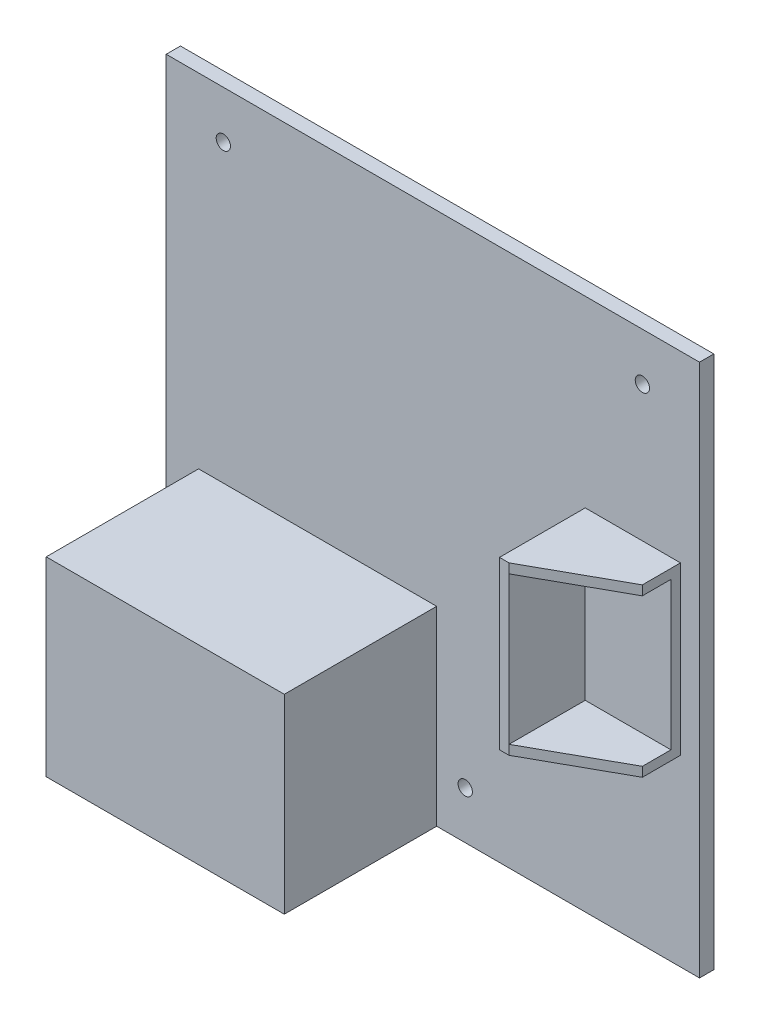
ISO-10303-21;
HEADER;
FILE_DESCRIPTION(('STEP AP214'),'2;1');
FILE_NAME('part.step','',(''),(''),'','','');
FILE_SCHEMA(('AUTOMOTIVE_DESIGN { 1 0 10303 214 1 1 1 1 }'));
ENDSEC;
DATA;
#1=APPLICATION_CONTEXT('core data for automotive mechanical design processes');
#2=APPLICATION_PROTOCOL_DEFINITION('international standard','automotive_design',2000,#1);
#3=PRODUCT_CONTEXT('',#1,'mechanical');
#4=PRODUCT('Part','Part','',(#3));
#5=PRODUCT_RELATED_PRODUCT_CATEGORY('part','',(#4));
#6=PRODUCT_DEFINITION_FORMATION('','',#4);
#7=PRODUCT_DEFINITION_CONTEXT('part definition',#1,'design');
#8=PRODUCT_DEFINITION('design','',#6,#7);
#9=PRODUCT_DEFINITION_SHAPE('','',#8);
#10=(LENGTH_UNIT() NAMED_UNIT(*) SI_UNIT(.MILLI.,.METRE.));
#11=(NAMED_UNIT(*) PLANE_ANGLE_UNIT() SI_UNIT($,.RADIAN.));
#12=(NAMED_UNIT(*) SI_UNIT($,.STERADIAN.) SOLID_ANGLE_UNIT());
#13=UNCERTAINTY_MEASURE_WITH_UNIT(LENGTH_MEASURE(1.E-05),#10,'distance_accuracy_value','');
#14=(GEOMETRIC_REPRESENTATION_CONTEXT(3) GLOBAL_UNCERTAINTY_ASSIGNED_CONTEXT((#13)) GLOBAL_UNIT_ASSIGNED_CONTEXT((#10,
#11,#12)) REPRESENTATION_CONTEXT('',''));
#15=CARTESIAN_POINT('',(0.,0.,0.));
#16=DIRECTION('',(0.,0.,1.));
#17=DIRECTION('',(1.,0.,0.));
#18=AXIS2_PLACEMENT_3D('',#15,#16,#17);
#19=CARTESIAN_POINT('',(0.,0.,3.));
#20=DIRECTION('',(0.,0.,-1.));
#21=DIRECTION('',(-1.,0.,0.));
#22=AXIS2_PLACEMENT_3D('',#19,#20,#21);
#23=PLANE('',#22);
#24=DIRECTION('',(0.,-1.,0.));
#25=VECTOR('',#24,1.);
#26=CARTESIAN_POINT('',(-49.1967650273224,-56.,3.));
#27=LINE('',#26,#25);
#28=CARTESIAN_POINT('',(-49.1967650273224,-16.,3.));
#29=VERTEX_POINT('',#28);
#30=CARTESIAN_POINT('',(-49.1967650273224,-56.,3.));
#31=VERTEX_POINT('',#30);
#32=EDGE_CURVE('E185',#29,#31,#27,.T.);
#33=ORIENTED_EDGE('',*,*,#32,.F.);
#34=DIRECTION('',(-1.,0.,0.));
#35=VECTOR('',#34,1.);
#36=CARTESIAN_POINT('',(-49.1967650273224,-16.,3.));
#37=LINE('',#36,#35);
#38=CARTESIAN_POINT('',(0.803234972677577,-16.,3.));
#39=VERTEX_POINT('',#38);
#40=EDGE_CURVE('E201',#39,#29,#37,.T.);
#41=ORIENTED_EDGE('',*,*,#40,.F.);
#42=DIRECTION('',(0.,1.,0.));
#43=VECTOR('',#42,1.);
#44=CARTESIAN_POINT('',(0.803234972677577,-56.,3.));
#45=LINE('',#44,#43);
#46=CARTESIAN_POINT('',(0.803234972677577,-56.,3.));
#47=VERTEX_POINT('',#46);
#48=EDGE_CURVE('E210',#47,#39,#45,.T.);
#49=ORIENTED_EDGE('',*,*,#48,.F.);
#50=DIRECTION('',(1.,0.,0.));
#51=VECTOR('',#50,1.);
#52=CARTESIAN_POINT('',(-56.,-56.,3.));
#53=LINE('',#52,#51);
#54=CARTESIAN_POINT('',(56.,-56.,3.));
#55=VERTEX_POINT('',#54);
#56=EDGE_CURVE('E235',#47,#55,#53,.T.);
#57=ORIENTED_EDGE('',*,*,#56,.T.);
#58=DIRECTION('',(0.,1.,0.));
#59=VECTOR('',#58,1.);
#60=CARTESIAN_POINT('',(56.,-56.,3.));
#61=LINE('',#60,#59);
#62=CARTESIAN_POINT('',(56.,56.,3.));
#63=VERTEX_POINT('',#62);
#64=EDGE_CURVE('E227',#55,#63,#61,.T.);
#65=ORIENTED_EDGE('',*,*,#64,.T.);
#66=DIRECTION('',(-1.,0.,0.));
#67=VECTOR('',#66,1.);
#68=CARTESIAN_POINT('',(-56.,56.,3.));
#69=LINE('',#68,#67);
#70=CARTESIAN_POINT('',(-56.,56.,3.));
#71=VERTEX_POINT('',#70);
#72=EDGE_CURVE('E230',#63,#71,#69,.T.);
#73=ORIENTED_EDGE('',*,*,#72,.T.);
#74=DIRECTION('',(0.,-1.,0.));
#75=VECTOR('',#74,1.);
#76=CARTESIAN_POINT('',(-56.,-56.,3.));
#77=LINE('',#76,#75);
#78=CARTESIAN_POINT('',(-56.,-56.,3.));
#79=VERTEX_POINT('',#78);
#80=EDGE_CURVE('E233',#71,#79,#77,.T.);
#81=ORIENTED_EDGE('',*,*,#80,.T.);
#82=EDGE_CURVE('E236',#79,#31,#53,.T.);
#83=ORIENTED_EDGE('',*,*,#82,.T.);
#84=EDGE_LOOP('',(#33,#41,#49,#57,#65,#73,#81,#83));
#85=FACE_BOUND('',#84,.T.);
#86=CARTESIAN_POINT('',(6.80323497267758,-46.,3.));
#87=DIRECTION('',(0.,0.,1.));
#88=DIRECTION('',(1.,0.,0.));
#89=AXIS2_PLACEMENT_3D('',#86,#87,#88);
#90=CIRCLE('',#89,1.5);
#91=CARTESIAN_POINT('',(8.30323497267758,-46.,3.));
#92=VERTEX_POINT('',#91);
#93=EDGE_CURVE('E175',#92,#92,#90,.T.);
#94=ORIENTED_EDGE('',*,*,#93,.F.);
#95=EDGE_LOOP('',(#94));
#96=FACE_BOUND('',#95,.T.);
#97=CARTESIAN_POINT('',(44.,46.,3.));
#98=DIRECTION('',(0.,0.,1.));
#99=DIRECTION('',(1.,0.,0.));
#100=AXIS2_PLACEMENT_3D('',#97,#98,#99);
#101=CIRCLE('',#100,1.5);
#102=CARTESIAN_POINT('',(45.5,46.,3.));
#103=VERTEX_POINT('',#102);
#104=EDGE_CURVE('E189',#103,#103,#101,.T.);
#105=ORIENTED_EDGE('',*,*,#104,.F.);
#106=EDGE_LOOP('',(#105));
#107=FACE_BOUND('',#106,.T.);
#108=CARTESIAN_POINT('',(-44.,46.,3.));
#109=DIRECTION('',(0.,0.,1.));
#110=DIRECTION('',(1.,0.,0.));
#111=AXIS2_PLACEMENT_3D('',#108,#109,#110);
#112=CIRCLE('',#111,1.5);
#113=CARTESIAN_POINT('',(-42.5,46.,3.));
#114=VERTEX_POINT('',#113);
#115=EDGE_CURVE('E182',#114,#114,#112,.T.);
#116=ORIENTED_EDGE('',*,*,#115,.F.);
#117=EDGE_LOOP('',(#116));
#118=FACE_BOUND('',#117,.T.);
#119=DIRECTION('',(0.,1.,0.));
#120=VECTOR('',#119,1.);
#121=CARTESIAN_POINT('',(52.,-17.5,3.));
#122=LINE('',#121,#120);
#123=CARTESIAN_POINT('',(52.,-17.5,3.));
#124=VERTEX_POINT('',#123);
#125=CARTESIAN_POINT('',(52.,17.5,3.));
#126=VERTEX_POINT('',#125);
#127=EDGE_CURVE('E170',#124,#126,#122,.T.);
#128=ORIENTED_EDGE('',*,*,#127,.F.);
#129=DIRECTION('',(1.,0.,0.));
#130=VECTOR('',#129,1.);
#131=CARTESIAN_POINT('',(32.,-17.5,3.));
#132=LINE('',#131,#130);
#133=CARTESIAN_POINT('',(32.,-17.5,3.));
#134=VERTEX_POINT('',#133);
#135=EDGE_CURVE('E523',#134,#124,#132,.T.);
#136=ORIENTED_EDGE('',*,*,#135,.F.);
#137=DIRECTION('',(0.,-1.,0.));
#138=VECTOR('',#137,1.);
#139=CARTESIAN_POINT('',(32.,-17.5,3.));
#140=LINE('',#139,#138);
#141=CARTESIAN_POINT('',(32.,17.5,3.));
#142=VERTEX_POINT('',#141);
#143=EDGE_CURVE('E532',#142,#134,#140,.T.);
#144=ORIENTED_EDGE('',*,*,#143,.F.);
#145=DIRECTION('',(-1.,0.,0.));
#146=VECTOR('',#145,1.);
#147=CARTESIAN_POINT('',(32.,17.5,3.));
#148=LINE('',#147,#146);
#149=EDGE_CURVE('E530',#126,#142,#148,.T.);
#150=ORIENTED_EDGE('',*,*,#149,.F.);
#151=EDGE_LOOP('',(#128,#136,#144,#150));
#152=FACE_BOUND('',#151,.T.);
#153=ADVANCED_FACE('F33',(#85,#96,#107,#118,#152),#23,.F.);
#154=CARTESIAN_POINT('',(56.,-56.,3.));
#155=DIRECTION('',(-1.,0.,0.));
#156=DIRECTION('',(0.,0.,1.));
#157=AXIS2_PLACEMENT_3D('',#154,#155,#156);
#158=PLANE('',#157);
#159=DIRECTION('',(0.,1.,0.));
#160=VECTOR('',#159,1.);
#161=CARTESIAN_POINT('',(56.,-56.,0.));
#162=LINE('',#161,#160);
#163=CARTESIAN_POINT('',(56.,-56.,0.));
#164=VERTEX_POINT('',#163);
#165=CARTESIAN_POINT('',(56.,56.,0.));
#166=VERTEX_POINT('',#165);
#167=EDGE_CURVE('E226',#164,#166,#162,.T.);
#168=ORIENTED_EDGE('',*,*,#167,.T.);
#169=DIRECTION('',(0.,0.,-1.));
#170=VECTOR('',#169,1.);
#171=CARTESIAN_POINT('',(56.,56.,3.));
#172=LINE('',#171,#170);
#173=EDGE_CURVE('E41',#63,#166,#172,.T.);
#174=ORIENTED_EDGE('',*,*,#173,.F.);
#175=ORIENTED_EDGE('',*,*,#64,.F.);
#176=DIRECTION('',(0.,0.,-1.));
#177=VECTOR('',#176,1.);
#178=CARTESIAN_POINT('',(56.,-56.,3.));
#179=LINE('',#178,#177);
#180=EDGE_CURVE('E238',#55,#164,#179,.T.);
#181=ORIENTED_EDGE('',*,*,#180,.T.);
#182=EDGE_LOOP('',(#168,#174,#175,#181));
#183=FACE_BOUND('',#182,.T.);
#184=ADVANCED_FACE('F35',(#183),#158,.F.);
#185=CARTESIAN_POINT('',(-56.,56.,3.));
#186=DIRECTION('',(0.,-1.,0.));
#187=DIRECTION('',(0.,0.,-1.));
#188=AXIS2_PLACEMENT_3D('',#185,#186,#187);
#189=PLANE('',#188);
#190=DIRECTION('',(-1.,0.,0.));
#191=VECTOR('',#190,1.);
#192=CARTESIAN_POINT('',(-56.,56.,0.));
#193=LINE('',#192,#191);
#194=CARTESIAN_POINT('',(-56.,56.,0.));
#195=VERTEX_POINT('',#194);
#196=EDGE_CURVE('E241',#166,#195,#193,.T.);
#197=ORIENTED_EDGE('',*,*,#196,.T.);
#198=DIRECTION('',(0.,0.,-1.));
#199=VECTOR('',#198,1.);
#200=CARTESIAN_POINT('',(-56.,56.,3.));
#201=LINE('',#200,#199);
#202=EDGE_CURVE('E251',#71,#195,#201,.T.);
#203=ORIENTED_EDGE('',*,*,#202,.F.);
#204=ORIENTED_EDGE('',*,*,#72,.F.);
#205=ORIENTED_EDGE('',*,*,#173,.T.);
#206=EDGE_LOOP('',(#197,#203,#204,#205));
#207=FACE_BOUND('',#206,.T.);
#208=ADVANCED_FACE('F256',(#207),#189,.F.);
#209=CARTESIAN_POINT('',(-56.,-56.,3.));
#210=DIRECTION('',(1.,0.,0.));
#211=DIRECTION('',(0.,0.,-1.));
#212=AXIS2_PLACEMENT_3D('',#209,#210,#211);
#213=PLANE('',#212);
#214=DIRECTION('',(0.,-1.,0.));
#215=VECTOR('',#214,1.);
#216=CARTESIAN_POINT('',(-56.,-56.,0.));
#217=LINE('',#216,#215);
#218=CARTESIAN_POINT('',(-56.,-56.,0.));
#219=VERTEX_POINT('',#218);
#220=EDGE_CURVE('E243',#195,#219,#217,.T.);
#221=ORIENTED_EDGE('',*,*,#220,.T.);
#222=DIRECTION('',(0.,0.,-1.));
#223=VECTOR('',#222,1.);
#224=CARTESIAN_POINT('',(-56.,-56.,3.));
#225=LINE('',#224,#223);
#226=EDGE_CURVE('E248',#79,#219,#225,.T.);
#227=ORIENTED_EDGE('',*,*,#226,.F.);
#228=ORIENTED_EDGE('',*,*,#80,.F.);
#229=ORIENTED_EDGE('',*,*,#202,.T.);
#230=EDGE_LOOP('',(#221,#227,#228,#229));
#231=FACE_BOUND('',#230,.T.);
#232=ADVANCED_FACE('F268',(#231),#213,.F.);
#233=CARTESIAN_POINT('',(-56.,-56.,3.));
#234=DIRECTION('',(0.,1.,0.));
#235=DIRECTION('',(-1.,0.,0.));
#236=AXIS2_PLACEMENT_3D('',#233,#234,#235);
#237=PLANE('',#236);
#238=DIRECTION('',(1.,0.,0.));
#239=VECTOR('',#238,1.);
#240=CARTESIAN_POINT('',(-56.,-56.,0.));
#241=LINE('',#240,#239);
#242=EDGE_CURVE('E231',#219,#164,#241,.T.);
#243=ORIENTED_EDGE('',*,*,#242,.T.);
#244=ORIENTED_EDGE('',*,*,#180,.F.);
#245=ORIENTED_EDGE('',*,*,#56,.F.);
#246=DIRECTION('',(0.,0.,-1.));
#247=VECTOR('',#246,1.);
#248=CARTESIAN_POINT('',(0.803234972677577,-56.,35.));
#249=LINE('',#248,#247);
#250=CARTESIAN_POINT('',(0.803234972677577,-56.,35.));
#251=VERTEX_POINT('',#250);
#252=EDGE_CURVE('E220',#251,#47,#249,.T.);
#253=ORIENTED_EDGE('',*,*,#252,.F.);
#254=DIRECTION('',(1.,0.,0.));
#255=VECTOR('',#254,1.);
#256=CARTESIAN_POINT('',(-49.1967650273224,-56.,35.));
#257=LINE('',#256,#255);
#258=CARTESIAN_POINT('',(-49.1967650273224,-56.,35.));
#259=VERTEX_POINT('',#258);
#260=EDGE_CURVE('E200',#259,#251,#257,.T.);
#261=ORIENTED_EDGE('',*,*,#260,.F.);
#262=DIRECTION('',(0.,0.,-1.));
#263=VECTOR('',#262,1.);
#264=CARTESIAN_POINT('',(-49.1967650273224,-56.,35.));
#265=LINE('',#264,#263);
#266=EDGE_CURVE('E223',#259,#31,#265,.T.);
#267=ORIENTED_EDGE('',*,*,#266,.T.);
#268=ORIENTED_EDGE('',*,*,#82,.F.);
#269=ORIENTED_EDGE('',*,*,#226,.T.);
#270=EDGE_LOOP('',(#243,#244,#245,#253,#261,#267,#268,#269));
#271=FACE_BOUND('',#270,.T.);
#272=ADVANCED_FACE('F272',(#271),#237,.F.);
#273=CARTESIAN_POINT('',(0.,0.,0.));
#274=DIRECTION('',(0.,0.,-1.));
#275=DIRECTION('',(-1.,0.,0.));
#276=AXIS2_PLACEMENT_3D('',#273,#274,#275);
#277=PLANE('',#276);
#278=CARTESIAN_POINT('',(-44.,46.,0.));
#279=DIRECTION('',(0.,0.,-1.));
#280=DIRECTION('',(-1.,0.,0.));
#281=AXIS2_PLACEMENT_3D('',#278,#279,#280);
#282=CIRCLE('',#281,1.5);
#283=CARTESIAN_POINT('',(-42.5,46.,0.));
#284=VERTEX_POINT('',#283);
#285=EDGE_CURVE('E186',#284,#284,#282,.F.);
#286=ORIENTED_EDGE('',*,*,#285,.T.);
#287=EDGE_LOOP('',(#286));
#288=FACE_BOUND('',#287,.T.);
#289=CARTESIAN_POINT('',(44.,46.,0.));
#290=DIRECTION('',(0.,0.,-1.));
#291=DIRECTION('',(-1.,0.,0.));
#292=AXIS2_PLACEMENT_3D('',#289,#290,#291);
#293=CIRCLE('',#292,1.5);
#294=CARTESIAN_POINT('',(45.5,46.,0.));
#295=VERTEX_POINT('',#294);
#296=EDGE_CURVE('E192',#295,#295,#293,.F.);
#297=ORIENTED_EDGE('',*,*,#296,.T.);
#298=EDGE_LOOP('',(#297));
#299=FACE_BOUND('',#298,.T.);
#300=CARTESIAN_POINT('',(6.80323497267758,-46.,0.));
#301=DIRECTION('',(0.,0.,-1.));
#302=DIRECTION('',(-1.,0.,0.));
#303=AXIS2_PLACEMENT_3D('',#300,#301,#302);
#304=CIRCLE('',#303,1.5);
#305=CARTESIAN_POINT('',(8.30323497267758,-46.,0.));
#306=VERTEX_POINT('',#305);
#307=EDGE_CURVE('E171',#306,#306,#304,.F.);
#308=ORIENTED_EDGE('',*,*,#307,.T.);
#309=EDGE_LOOP('',(#308));
#310=FACE_BOUND('',#309,.T.);
#311=ORIENTED_EDGE('',*,*,#167,.F.);
#312=ORIENTED_EDGE('',*,*,#242,.F.);
#313=ORIENTED_EDGE('',*,*,#220,.F.);
#314=ORIENTED_EDGE('',*,*,#196,.F.);
#315=EDGE_LOOP('',(#311,#312,#313,#314));
#316=FACE_BOUND('',#315,.T.);
#317=ADVANCED_FACE('F264',(#288,#299,#310,#316),#277,.T.);
#318=CARTESIAN_POINT('',(-49.1967650273224,-56.,35.));
#319=DIRECTION('',(1.,0.,0.));
#320=DIRECTION('',(0.,0.,-1.));
#321=AXIS2_PLACEMENT_3D('',#318,#319,#320);
#322=PLANE('',#321);
#323=ORIENTED_EDGE('',*,*,#32,.T.);
#324=ORIENTED_EDGE('',*,*,#266,.F.);
#325=DIRECTION('',(0.,-1.,0.));
#326=VECTOR('',#325,1.);
#327=CARTESIAN_POINT('',(-49.1967650273224,-56.,35.));
#328=LINE('',#327,#326);
#329=CARTESIAN_POINT('',(-49.1967650273224,-16.,35.));
#330=VERTEX_POINT('',#329);
#331=EDGE_CURVE('E197',#330,#259,#328,.T.);
#332=ORIENTED_EDGE('',*,*,#331,.F.);
#333=DIRECTION('',(0.,0.,-1.));
#334=VECTOR('',#333,1.);
#335=CARTESIAN_POINT('',(-49.1967650273224,-16.,35.));
#336=LINE('',#335,#334);
#337=EDGE_CURVE('E207',#330,#29,#336,.T.);
#338=ORIENTED_EDGE('',*,*,#337,.T.);
#339=EDGE_LOOP('',(#323,#324,#332,#338));
#340=FACE_BOUND('',#339,.T.);
#341=ADVANCED_FACE('F288',(#340),#322,.F.);
#342=CARTESIAN_POINT('',(0.803234972677577,-56.,35.));
#343=DIRECTION('',(-1.,0.,0.));
#344=DIRECTION('',(0.,0.,1.));
#345=AXIS2_PLACEMENT_3D('',#342,#343,#344);
#346=PLANE('',#345);
#347=ORIENTED_EDGE('',*,*,#48,.T.);
#348=DIRECTION('',(0.,0.,-1.));
#349=VECTOR('',#348,1.);
#350=CARTESIAN_POINT('',(0.803234972677577,-16.,35.));
#351=LINE('',#350,#349);
#352=CARTESIAN_POINT('',(0.803234972677577,-16.,35.));
#353=VERTEX_POINT('',#352);
#354=EDGE_CURVE('E217',#353,#39,#351,.T.);
#355=ORIENTED_EDGE('',*,*,#354,.F.);
#356=DIRECTION('',(0.,1.,0.));
#357=VECTOR('',#356,1.);
#358=CARTESIAN_POINT('',(0.803234972677577,-56.,35.));
#359=LINE('',#358,#357);
#360=EDGE_CURVE('E203',#251,#353,#359,.T.);
#361=ORIENTED_EDGE('',*,*,#360,.F.);
#362=ORIENTED_EDGE('',*,*,#252,.T.);
#363=EDGE_LOOP('',(#347,#355,#361,#362));
#364=FACE_BOUND('',#363,.T.);
#365=ADVANCED_FACE('F280',(#364),#346,.F.);
#366=CARTESIAN_POINT('',(-49.1967650273224,-16.,35.));
#367=DIRECTION('',(0.,-1.,0.));
#368=DIRECTION('',(0.,0.,-1.));
#369=AXIS2_PLACEMENT_3D('',#366,#367,#368);
#370=PLANE('',#369);
#371=ORIENTED_EDGE('',*,*,#40,.T.);
#372=ORIENTED_EDGE('',*,*,#337,.F.);
#373=DIRECTION('',(-1.,0.,0.));
#374=VECTOR('',#373,1.);
#375=CARTESIAN_POINT('',(-49.1967650273224,-16.,35.));
#376=LINE('',#375,#374);
#377=EDGE_CURVE('E205',#353,#330,#376,.T.);
#378=ORIENTED_EDGE('',*,*,#377,.F.);
#379=ORIENTED_EDGE('',*,*,#354,.T.);
#380=EDGE_LOOP('',(#371,#372,#378,#379));
#381=FACE_BOUND('',#380,.T.);
#382=ADVANCED_FACE('F290',(#381),#370,.F.);
#383=CARTESIAN_POINT('',(0.,0.,35.));
#384=DIRECTION('',(0.,0.,-1.));
#385=DIRECTION('',(-1.,0.,0.));
#386=AXIS2_PLACEMENT_3D('',#383,#384,#385);
#387=PLANE('',#386);
#388=ORIENTED_EDGE('',*,*,#331,.T.);
#389=ORIENTED_EDGE('',*,*,#260,.T.);
#390=ORIENTED_EDGE('',*,*,#360,.T.);
#391=ORIENTED_EDGE('',*,*,#377,.T.);
#392=EDGE_LOOP('',(#388,#389,#390,#391));
#393=FACE_BOUND('',#392,.T.);
#394=ADVANCED_FACE('F284',(#393),#387,.F.);
#395=CARTESIAN_POINT('',(6.80323497267758,-46.,-0.00100000000000013));
#396=DIRECTION('',(0.,0.,1.));
#397=DIRECTION('',(1.,0.,0.));
#398=AXIS2_PLACEMENT_3D('',#395,#396,#397);
#399=CYLINDRICAL_SURFACE('',#398,1.5);
#400=CARTESIAN_POINT('',(8.30323497267758,-46.,0.));
#401=CARTESIAN_POINT('',(8.30323497267758,-46.,0.03125));
#402=CARTESIAN_POINT('',(8.30323497267758,-46.,0.0625));
#403=CARTESIAN_POINT('',(8.30323497267758,-46.,0.125));
#404=CARTESIAN_POINT('',(8.30323497267758,-46.,0.15625));
#405=CARTESIAN_POINT('',(8.30323497267758,-46.,0.21875));
#406=CARTESIAN_POINT('',(8.30323497267758,-46.,0.25));
#407=CARTESIAN_POINT('',(8.30323497267758,-46.,0.3125));
#408=CARTESIAN_POINT('',(8.30323497267758,-46.,0.34375));
#409=CARTESIAN_POINT('',(8.30323497267758,-46.,0.40625));
#410=CARTESIAN_POINT('',(8.30323497267758,-46.,0.4375));
#411=CARTESIAN_POINT('',(8.30323497267758,-46.,0.5));
#412=CARTESIAN_POINT('',(8.30323497267758,-46.,0.53125));
#413=CARTESIAN_POINT('',(8.30323497267758,-46.,0.59375));
#414=CARTESIAN_POINT('',(8.30323497267758,-46.,0.625));
#415=CARTESIAN_POINT('',(8.30323497267758,-46.,0.6875));
#416=CARTESIAN_POINT('',(8.30323497267758,-46.,0.71875));
#417=CARTESIAN_POINT('',(8.30323497267758,-46.,0.78125));
#418=CARTESIAN_POINT('',(8.30323497267758,-46.,0.8125));
#419=CARTESIAN_POINT('',(8.30323497267758,-46.,0.875));
#420=CARTESIAN_POINT('',(8.30323497267758,-46.,0.90625));
#421=CARTESIAN_POINT('',(8.30323497267758,-46.,0.96875));
#422=CARTESIAN_POINT('',(8.30323497267758,-46.,1.));
#423=CARTESIAN_POINT('',(8.30323497267758,-46.,1.0625));
#424=CARTESIAN_POINT('',(8.30323497267758,-46.,1.09375));
#425=CARTESIAN_POINT('',(8.30323497267758,-46.,1.15625));
#426=CARTESIAN_POINT('',(8.30323497267758,-46.,1.1875));
#427=CARTESIAN_POINT('',(8.30323497267758,-46.,1.25));
#428=CARTESIAN_POINT('',(8.30323497267758,-46.,1.28125));
#429=CARTESIAN_POINT('',(8.30323497267758,-46.,1.34375));
#430=CARTESIAN_POINT('',(8.30323497267758,-46.,1.375));
#431=CARTESIAN_POINT('',(8.30323497267758,-46.,1.4375));
#432=CARTESIAN_POINT('',(8.30323497267758,-46.,1.46875));
#433=CARTESIAN_POINT('',(8.30323497267758,-46.,1.53125));
#434=CARTESIAN_POINT('',(8.30323497267758,-46.,1.5625));
#435=CARTESIAN_POINT('',(8.30323497267758,-46.,1.625));
#436=CARTESIAN_POINT('',(8.30323497267758,-46.,1.65625));
#437=CARTESIAN_POINT('',(8.30323497267758,-46.,1.71875));
#438=CARTESIAN_POINT('',(8.30323497267758,-46.,1.75));
#439=CARTESIAN_POINT('',(8.30323497267758,-46.,1.8125));
#440=CARTESIAN_POINT('',(8.30323497267758,-46.,1.84375));
#441=CARTESIAN_POINT('',(8.30323497267758,-46.,1.90625));
#442=CARTESIAN_POINT('',(8.30323497267758,-46.,1.9375));
#443=CARTESIAN_POINT('',(8.30323497267758,-46.,2.));
#444=CARTESIAN_POINT('',(8.30323497267758,-46.,2.03125));
#445=CARTESIAN_POINT('',(8.30323497267758,-46.,2.09375));
#446=CARTESIAN_POINT('',(8.30323497267758,-46.,2.125));
#447=CARTESIAN_POINT('',(8.30323497267758,-46.,2.1875));
#448=CARTESIAN_POINT('',(8.30323497267758,-46.,2.21875));
#449=CARTESIAN_POINT('',(8.30323497267758,-46.,2.28125));
#450=CARTESIAN_POINT('',(8.30323497267758,-46.,2.3125));
#451=CARTESIAN_POINT('',(8.30323497267758,-46.,2.375));
#452=CARTESIAN_POINT('',(8.30323497267758,-46.,2.40625));
#453=CARTESIAN_POINT('',(8.30323497267758,-46.,2.46875));
#454=CARTESIAN_POINT('',(8.30323497267758,-46.,2.5));
#455=CARTESIAN_POINT('',(8.30323497267758,-46.,2.5625));
#456=CARTESIAN_POINT('',(8.30323497267758,-46.,2.59375));
#457=CARTESIAN_POINT('',(8.30323497267758,-46.,2.65625));
#458=CARTESIAN_POINT('',(8.30323497267758,-46.,2.6875));
#459=CARTESIAN_POINT('',(8.30323497267758,-46.,2.75));
#460=CARTESIAN_POINT('',(8.30323497267758,-46.,2.78125));
#461=CARTESIAN_POINT('',(8.30323497267758,-46.,2.84375));
#462=CARTESIAN_POINT('',(8.30323497267758,-46.,2.875));
#463=CARTESIAN_POINT('',(8.30323497267758,-46.,2.9375));
#464=CARTESIAN_POINT('',(8.30323497267758,-46.,2.96875));
#465=CARTESIAN_POINT('',(8.30323497267758,-46.,3.));
#466=B_SPLINE_CURVE_WITH_KNOTS('',3,(#400,#401,#402,#403,#404,#405,#406,#407,#408,#409,#410,
#411,#412,#413,#414,#415,#416,#417,#418,#419,#420,#421,#422,#423,#424,#425,#426,#427,#428,#429,
#430,#431,#432,#433,#434,#435,#436,#437,#438,#439,#440,#441,#442,#443,#444,#445,#446,#447,#448,
#449,#450,#451,#452,#453,#454,#455,#456,#457,#458,#459,#460,#461,#462,#463,#464,#465),
.UNSPECIFIED.,.F.,.F.,(4,2,2,2,2,2,2,2,2,2,2,2,2,2,2,2,2,2,2,2,2,2,2,2,2,2,2,2,2,2,2,2,4),(0.,
0.09375,0.1875,0.28125,0.375,0.46875,0.5625,0.65625,0.75,0.84375,0.9375,1.03125,1.125,1.21875,
1.3125,1.40625,1.5,1.59375,1.6875,1.78125,1.875,1.96875,2.0625,2.15625,2.25,2.34375,2.4375,
2.53125,2.625,2.71875,2.8125,2.90625,3.),.UNSPECIFIED.);
#467=EDGE_CURVE('BSEAM297',#306,#92,#466,.T.);
#468=ORIENTED_EDGE('',*,*,#307,.F.);
#469=ORIENTED_EDGE('',*,*,#93,.T.);
#470=ORIENTED_EDGE('',*,*,#467,.T.);
#471=ORIENTED_EDGE('',*,*,#467,.F.);
#472=EDGE_LOOP('',(#468,#470,#469,#471));
#473=FACE_BOUND('',#472,.T.);
#474=ADVANCED_FACE('F297',(#473),#399,.F.);
#475=CARTESIAN_POINT('',(44.,46.,-0.00100000000000013));
#476=DIRECTION('',(0.,0.,1.));
#477=DIRECTION('',(1.,0.,0.));
#478=AXIS2_PLACEMENT_3D('',#475,#476,#477);
#479=CYLINDRICAL_SURFACE('',#478,1.5);
#480=CARTESIAN_POINT('',(45.5,46.,0.));
#481=CARTESIAN_POINT('',(45.5,46.,0.03125));
#482=CARTESIAN_POINT('',(45.5,46.,0.0625));
#483=CARTESIAN_POINT('',(45.5,46.,0.125));
#484=CARTESIAN_POINT('',(45.5,46.,0.15625));
#485=CARTESIAN_POINT('',(45.5,46.,0.21875));
#486=CARTESIAN_POINT('',(45.5,46.,0.25));
#487=CARTESIAN_POINT('',(45.5,46.,0.3125));
#488=CARTESIAN_POINT('',(45.5,46.,0.34375));
#489=CARTESIAN_POINT('',(45.5,46.,0.40625));
#490=CARTESIAN_POINT('',(45.5,46.,0.4375));
#491=CARTESIAN_POINT('',(45.5,46.,0.5));
#492=CARTESIAN_POINT('',(45.5,46.,0.53125));
#493=CARTESIAN_POINT('',(45.5,46.,0.59375));
#494=CARTESIAN_POINT('',(45.5,46.,0.625));
#495=CARTESIAN_POINT('',(45.5,46.,0.6875));
#496=CARTESIAN_POINT('',(45.5,46.,0.71875));
#497=CARTESIAN_POINT('',(45.5,46.,0.78125));
#498=CARTESIAN_POINT('',(45.5,46.,0.8125));
#499=CARTESIAN_POINT('',(45.5,46.,0.875));
#500=CARTESIAN_POINT('',(45.5,46.,0.90625));
#501=CARTESIAN_POINT('',(45.5,46.,0.96875));
#502=CARTESIAN_POINT('',(45.5,46.,1.));
#503=CARTESIAN_POINT('',(45.5,46.,1.0625));
#504=CARTESIAN_POINT('',(45.5,46.,1.09375));
#505=CARTESIAN_POINT('',(45.5,46.,1.15625));
#506=CARTESIAN_POINT('',(45.5,46.,1.1875));
#507=CARTESIAN_POINT('',(45.5,46.,1.25));
#508=CARTESIAN_POINT('',(45.5,46.,1.28125));
#509=CARTESIAN_POINT('',(45.5,46.,1.34375));
#510=CARTESIAN_POINT('',(45.5,46.,1.375));
#511=CARTESIAN_POINT('',(45.5,46.,1.4375));
#512=CARTESIAN_POINT('',(45.5,46.,1.46875));
#513=CARTESIAN_POINT('',(45.5,46.,1.53125));
#514=CARTESIAN_POINT('',(45.5,46.,1.5625));
#515=CARTESIAN_POINT('',(45.5,46.,1.625));
#516=CARTESIAN_POINT('',(45.5,46.,1.65625));
#517=CARTESIAN_POINT('',(45.5,46.,1.71875));
#518=CARTESIAN_POINT('',(45.5,46.,1.75));
#519=CARTESIAN_POINT('',(45.5,46.,1.8125));
#520=CARTESIAN_POINT('',(45.5,46.,1.84375));
#521=CARTESIAN_POINT('',(45.5,46.,1.90625));
#522=CARTESIAN_POINT('',(45.5,46.,1.9375));
#523=CARTESIAN_POINT('',(45.5,46.,2.));
#524=CARTESIAN_POINT('',(45.5,46.,2.03125));
#525=CARTESIAN_POINT('',(45.5,46.,2.09375));
#526=CARTESIAN_POINT('',(45.5,46.,2.125));
#527=CARTESIAN_POINT('',(45.5,46.,2.1875));
#528=CARTESIAN_POINT('',(45.5,46.,2.21875));
#529=CARTESIAN_POINT('',(45.5,46.,2.28125));
#530=CARTESIAN_POINT('',(45.5,46.,2.3125));
#531=CARTESIAN_POINT('',(45.5,46.,2.375));
#532=CARTESIAN_POINT('',(45.5,46.,2.40625));
#533=CARTESIAN_POINT('',(45.5,46.,2.46875));
#534=CARTESIAN_POINT('',(45.5,46.,2.5));
#535=CARTESIAN_POINT('',(45.5,46.,2.5625));
#536=CARTESIAN_POINT('',(45.5,46.,2.59375));
#537=CARTESIAN_POINT('',(45.5,46.,2.65625));
#538=CARTESIAN_POINT('',(45.5,46.,2.6875));
#539=CARTESIAN_POINT('',(45.5,46.,2.75));
#540=CARTESIAN_POINT('',(45.5,46.,2.78125));
#541=CARTESIAN_POINT('',(45.5,46.,2.84375));
#542=CARTESIAN_POINT('',(45.5,46.,2.875));
#543=CARTESIAN_POINT('',(45.5,46.,2.9375));
#544=CARTESIAN_POINT('',(45.5,46.,2.96875));
#545=CARTESIAN_POINT('',(45.5,46.,3.));
#546=B_SPLINE_CURVE_WITH_KNOTS('',3,(#480,#481,#482,#483,#484,#485,#486,#487,#488,#489,#490,
#491,#492,#493,#494,#495,#496,#497,#498,#499,#500,#501,#502,#503,#504,#505,#506,#507,#508,#509,
#510,#511,#512,#513,#514,#515,#516,#517,#518,#519,#520,#521,#522,#523,#524,#525,#526,#527,#528,
#529,#530,#531,#532,#533,#534,#535,#536,#537,#538,#539,#540,#541,#542,#543,#544,#545),
.UNSPECIFIED.,.F.,.F.,(4,2,2,2,2,2,2,2,2,2,2,2,2,2,2,2,2,2,2,2,2,2,2,2,2,2,2,2,2,2,2,2,4),(0.,
0.09375,0.1875,0.28125,0.375,0.46875,0.5625,0.65625,0.75,0.84375,0.9375,1.03125,1.125,1.21875,
1.3125,1.40625,1.5,1.59375,1.6875,1.78125,1.875,1.96875,2.0625,2.15625,2.25,2.34375,2.4375,
2.53125,2.625,2.71875,2.8125,2.90625,3.),.UNSPECIFIED.);
#547=EDGE_CURVE('BSEAM358',#295,#103,#546,.T.);
#548=ORIENTED_EDGE('',*,*,#296,.F.);
#549=ORIENTED_EDGE('',*,*,#104,.T.);
#550=ORIENTED_EDGE('',*,*,#547,.T.);
#551=ORIENTED_EDGE('',*,*,#547,.F.);
#552=EDGE_LOOP('',(#548,#550,#549,#551));
#553=FACE_BOUND('',#552,.T.);
#554=ADVANCED_FACE('F358',(#553),#479,.F.);
#555=CARTESIAN_POINT('',(-44.,46.,-0.00100000000000013));
#556=DIRECTION('',(0.,0.,1.));
#557=DIRECTION('',(1.,0.,0.));
#558=AXIS2_PLACEMENT_3D('',#555,#556,#557);
#559=CYLINDRICAL_SURFACE('',#558,1.5);
#560=CARTESIAN_POINT('',(-42.5,46.,0.));
#561=CARTESIAN_POINT('',(-42.5,46.,0.03125));
#562=CARTESIAN_POINT('',(-42.5,46.,0.0625));
#563=CARTESIAN_POINT('',(-42.5,46.,0.125));
#564=CARTESIAN_POINT('',(-42.5,46.,0.15625));
#565=CARTESIAN_POINT('',(-42.5,46.,0.21875));
#566=CARTESIAN_POINT('',(-42.5,46.,0.25));
#567=CARTESIAN_POINT('',(-42.5,46.,0.3125));
#568=CARTESIAN_POINT('',(-42.5,46.,0.34375));
#569=CARTESIAN_POINT('',(-42.5,46.,0.40625));
#570=CARTESIAN_POINT('',(-42.5,46.,0.4375));
#571=CARTESIAN_POINT('',(-42.5,46.,0.5));
#572=CARTESIAN_POINT('',(-42.5,46.,0.53125));
#573=CARTESIAN_POINT('',(-42.5,46.,0.59375));
#574=CARTESIAN_POINT('',(-42.5,46.,0.625));
#575=CARTESIAN_POINT('',(-42.5,46.,0.6875));
#576=CARTESIAN_POINT('',(-42.5,46.,0.71875));
#577=CARTESIAN_POINT('',(-42.5,46.,0.78125));
#578=CARTESIAN_POINT('',(-42.5,46.,0.8125));
#579=CARTESIAN_POINT('',(-42.5,46.,0.875));
#580=CARTESIAN_POINT('',(-42.5,46.,0.90625));
#581=CARTESIAN_POINT('',(-42.5,46.,0.96875));
#582=CARTESIAN_POINT('',(-42.5,46.,1.));
#583=CARTESIAN_POINT('',(-42.5,46.,1.0625));
#584=CARTESIAN_POINT('',(-42.5,46.,1.09375));
#585=CARTESIAN_POINT('',(-42.5,46.,1.15625));
#586=CARTESIAN_POINT('',(-42.5,46.,1.1875));
#587=CARTESIAN_POINT('',(-42.5,46.,1.25));
#588=CARTESIAN_POINT('',(-42.5,46.,1.28125));
#589=CARTESIAN_POINT('',(-42.5,46.,1.34375));
#590=CARTESIAN_POINT('',(-42.5,46.,1.375));
#591=CARTESIAN_POINT('',(-42.5,46.,1.4375));
#592=CARTESIAN_POINT('',(-42.5,46.,1.46875));
#593=CARTESIAN_POINT('',(-42.5,46.,1.53125));
#594=CARTESIAN_POINT('',(-42.5,46.,1.5625));
#595=CARTESIAN_POINT('',(-42.5,46.,1.625));
#596=CARTESIAN_POINT('',(-42.5,46.,1.65625));
#597=CARTESIAN_POINT('',(-42.5,46.,1.71875));
#598=CARTESIAN_POINT('',(-42.5,46.,1.75));
#599=CARTESIAN_POINT('',(-42.5,46.,1.8125));
#600=CARTESIAN_POINT('',(-42.5,46.,1.84375));
#601=CARTESIAN_POINT('',(-42.5,46.,1.90625));
#602=CARTESIAN_POINT('',(-42.5,46.,1.9375));
#603=CARTESIAN_POINT('',(-42.5,46.,2.));
#604=CARTESIAN_POINT('',(-42.5,46.,2.03125));
#605=CARTESIAN_POINT('',(-42.5,46.,2.09375));
#606=CARTESIAN_POINT('',(-42.5,46.,2.125));
#607=CARTESIAN_POINT('',(-42.5,46.,2.1875));
#608=CARTESIAN_POINT('',(-42.5,46.,2.21875));
#609=CARTESIAN_POINT('',(-42.5,46.,2.28125));
#610=CARTESIAN_POINT('',(-42.5,46.,2.3125));
#611=CARTESIAN_POINT('',(-42.5,46.,2.375));
#612=CARTESIAN_POINT('',(-42.5,46.,2.40625));
#613=CARTESIAN_POINT('',(-42.5,46.,2.46875));
#614=CARTESIAN_POINT('',(-42.5,46.,2.5));
#615=CARTESIAN_POINT('',(-42.5,46.,2.5625));
#616=CARTESIAN_POINT('',(-42.5,46.,2.59375));
#617=CARTESIAN_POINT('',(-42.5,46.,2.65625));
#618=CARTESIAN_POINT('',(-42.5,46.,2.6875));
#619=CARTESIAN_POINT('',(-42.5,46.,2.75));
#620=CARTESIAN_POINT('',(-42.5,46.,2.78125));
#621=CARTESIAN_POINT('',(-42.5,46.,2.84375));
#622=CARTESIAN_POINT('',(-42.5,46.,2.875));
#623=CARTESIAN_POINT('',(-42.5,46.,2.9375));
#624=CARTESIAN_POINT('',(-42.5,46.,2.96875));
#625=CARTESIAN_POINT('',(-42.5,46.,3.));
#626=B_SPLINE_CURVE_WITH_KNOTS('',3,(#560,#561,#562,#563,#564,#565,#566,#567,#568,#569,#570,
#571,#572,#573,#574,#575,#576,#577,#578,#579,#580,#581,#582,#583,#584,#585,#586,#587,#588,#589,
#590,#591,#592,#593,#594,#595,#596,#597,#598,#599,#600,#601,#602,#603,#604,#605,#606,#607,#608,
#609,#610,#611,#612,#613,#614,#615,#616,#617,#618,#619,#620,#621,#622,#623,#624,#625),
.UNSPECIFIED.,.F.,.F.,(4,2,2,2,2,2,2,2,2,2,2,2,2,2,2,2,2,2,2,2,2,2,2,2,2,2,2,2,2,2,2,2,4),(0.,
0.09375,0.1875,0.28125,0.375,0.46875,0.5625,0.65625,0.75,0.84375,0.9375,1.03125,1.125,1.21875,
1.3125,1.40625,1.5,1.59375,1.6875,1.78125,1.875,1.96875,2.0625,2.15625,2.25,2.34375,2.4375,
2.53125,2.625,2.71875,2.8125,2.90625,3.),.UNSPECIFIED.);
#627=EDGE_CURVE('BSEAM365',#284,#114,#626,.T.);
#628=ORIENTED_EDGE('',*,*,#285,.F.);
#629=ORIENTED_EDGE('',*,*,#115,.T.);
#630=ORIENTED_EDGE('',*,*,#627,.T.);
#631=ORIENTED_EDGE('',*,*,#627,.F.);
#632=EDGE_LOOP('',(#628,#630,#629,#631));
#633=FACE_BOUND('',#632,.T.);
#634=ADVANCED_FACE('F365',(#633),#559,.F.);
#635=CARTESIAN_POINT('',(52.,-17.5,21.));
#636=DIRECTION('',(-1.,0.,0.));
#637=DIRECTION('',(0.,0.,1.));
#638=AXIS2_PLACEMENT_3D('',#635,#636,#637);
#639=PLANE('',#638);
#640=DIRECTION('',(0.,0.,-1.));
#641=VECTOR('',#640,1.);
#642=CARTESIAN_POINT('',(52.,17.5,21.));
#643=LINE('',#642,#641);
#644=CARTESIAN_POINT('',(52.,17.5,11.));
#645=VERTEX_POINT('',#644);
#646=EDGE_CURVE('E55',#645,#126,#643,.T.);
#647=ORIENTED_EDGE('',*,*,#646,.F.);
#648=DIRECTION('',(0.,1.,0.));
#649=VECTOR('',#648,1.);
#650=CARTESIAN_POINT('',(52.,-56.,11.));
#651=LINE('',#650,#649);
#652=CARTESIAN_POINT('',(52.,15.5,11.));
#653=VERTEX_POINT('',#652);
#654=EDGE_CURVE('E152',#653,#645,#651,.T.);
#655=ORIENTED_EDGE('',*,*,#654,.F.);
#656=DIRECTION('',(0.,0.,1.));
#657=VECTOR('',#656,1.);
#658=CARTESIAN_POINT('',(52.,15.5,5.));
#659=LINE('',#658,#657);
#660=CARTESIAN_POINT('',(52.,15.5,5.));
#661=VERTEX_POINT('',#660);
#662=EDGE_CURVE('E514',#661,#653,#659,.T.);
#663=ORIENTED_EDGE('',*,*,#662,.F.);
#664=DIRECTION('',(0.,1.,0.));
#665=VECTOR('',#664,1.);
#666=CARTESIAN_POINT('',(52.,0.,5.));
#667=LINE('',#666,#665);
#668=CARTESIAN_POINT('',(52.,-15.5,5.));
#669=VERTEX_POINT('',#668);
#670=EDGE_CURVE('E501',#669,#661,#667,.T.);
#671=ORIENTED_EDGE('',*,*,#670,.F.);
#672=DIRECTION('',(0.,0.,1.));
#673=VECTOR('',#672,1.);
#674=CARTESIAN_POINT('',(52.,-15.5,5.));
#675=LINE('',#674,#673);
#676=CARTESIAN_POINT('',(52.,-15.5,11.));
#677=VERTEX_POINT('',#676);
#678=EDGE_CURVE('E516',#669,#677,#675,.T.);
#679=ORIENTED_EDGE('',*,*,#678,.T.);
#680=CARTESIAN_POINT('',(52.,-17.5,11.));
#681=VERTEX_POINT('',#680);
#682=EDGE_CURVE('E48',#681,#677,#651,.T.);
#683=ORIENTED_EDGE('',*,*,#682,.F.);
#684=DIRECTION('',(0.,0.,-1.));
#685=VECTOR('',#684,1.);
#686=CARTESIAN_POINT('',(52.,-17.5,21.));
#687=LINE('',#686,#685);
#688=EDGE_CURVE('E528',#681,#124,#687,.T.);
#689=ORIENTED_EDGE('',*,*,#688,.T.);
#690=ORIENTED_EDGE('',*,*,#127,.T.);
#691=EDGE_LOOP('',(#647,#655,#663,#671,#679,#683,#689,#690));
#692=FACE_BOUND('',#691,.T.);
#693=ADVANCED_FACE('F168',(#692),#639,.F.);
#694=CARTESIAN_POINT('',(32.,17.5,21.));
#695=DIRECTION('',(0.,-1.,0.));
#696=DIRECTION('',(0.,0.,-1.));
#697=AXIS2_PLACEMENT_3D('',#694,#695,#696);
#698=PLANE('',#697);
#699=DIRECTION('',(-1.,0.,0.));
#700=VECTOR('',#699,1.);
#701=CARTESIAN_POINT('',(32.,17.5,21.));
#702=LINE('',#701,#700);
#703=CARTESIAN_POINT('',(34.,17.5,21.));
#704=VERTEX_POINT('',#703);
#705=CARTESIAN_POINT('',(32.,17.5,21.));
#706=VERTEX_POINT('',#705);
#707=EDGE_CURVE('E165',#704,#706,#702,.T.);
#708=ORIENTED_EDGE('',*,*,#707,.F.);
#709=DIRECTION('',(-0.874157276121538,0.,0.485642931178632));
#710=VECTOR('',#709,1.);
#711=CARTESIAN_POINT('',(34.,17.5,21.));
#712=LINE('',#711,#710);
#713=EDGE_CURVE('E154',#645,#704,#712,.T.);
#714=ORIENTED_EDGE('',*,*,#713,.F.);
#715=ORIENTED_EDGE('',*,*,#646,.T.);
#716=ORIENTED_EDGE('',*,*,#149,.T.);
#717=DIRECTION('',(0.,0.,-1.));
#718=VECTOR('',#717,1.);
#719=CARTESIAN_POINT('',(32.,17.5,21.));
#720=LINE('',#719,#718);
#721=EDGE_CURVE('E172',#706,#142,#720,.T.);
#722=ORIENTED_EDGE('',*,*,#721,.F.);
#723=EDGE_LOOP('',(#708,#714,#715,#716,#722));
#724=FACE_BOUND('',#723,.T.);
#725=ADVANCED_FACE('F163',(#724),#698,.F.);
#726=CARTESIAN_POINT('',(32.,-17.5,21.));
#727=DIRECTION('',(1.,0.,0.));
#728=DIRECTION('',(0.,0.,-1.));
#729=AXIS2_PLACEMENT_3D('',#726,#727,#728);
#730=PLANE('',#729);
#731=ORIENTED_EDGE('',*,*,#143,.T.);
#732=DIRECTION('',(0.,0.,-1.));
#733=VECTOR('',#732,1.);
#734=CARTESIAN_POINT('',(32.,-17.5,21.));
#735=LINE('',#734,#733);
#736=CARTESIAN_POINT('',(32.,-17.5,21.));
#737=VERTEX_POINT('',#736);
#738=EDGE_CURVE('E178',#737,#134,#735,.T.);
#739=ORIENTED_EDGE('',*,*,#738,.F.);
#740=DIRECTION('',(0.,-1.,0.));
#741=VECTOR('',#740,1.);
#742=CARTESIAN_POINT('',(32.,-17.5,21.));
#743=LINE('',#742,#741);
#744=EDGE_CURVE('E522',#706,#737,#743,.T.);
#745=ORIENTED_EDGE('',*,*,#744,.F.);
#746=ORIENTED_EDGE('',*,*,#721,.T.);
#747=EDGE_LOOP('',(#731,#739,#745,#746));
#748=FACE_BOUND('',#747,.T.);
#749=ADVANCED_FACE('F387',(#748),#730,.F.);
#750=CARTESIAN_POINT('',(32.,-17.5,21.));
#751=DIRECTION('',(0.,1.,0.));
#752=DIRECTION('',(0.,0.,1.));
#753=AXIS2_PLACEMENT_3D('',#750,#751,#752);
#754=PLANE('',#753);
#755=ORIENTED_EDGE('',*,*,#688,.F.);
#756=DIRECTION('',(-0.874157276121538,0.,0.485642931178632));
#757=VECTOR('',#756,1.);
#758=CARTESIAN_POINT('',(32.4716981132075,-17.5,21.8490566037736));
#759=LINE('',#758,#757);
#760=CARTESIAN_POINT('',(34.,-17.5,21.));
#761=VERTEX_POINT('',#760);
#762=EDGE_CURVE('E504',#681,#761,#759,.T.);
#763=ORIENTED_EDGE('',*,*,#762,.T.);
#764=DIRECTION('',(1.,0.,0.));
#765=VECTOR('',#764,1.);
#766=CARTESIAN_POINT('',(32.,-17.5,21.));
#767=LINE('',#766,#765);
#768=EDGE_CURVE('E525',#737,#761,#767,.T.);
#769=ORIENTED_EDGE('',*,*,#768,.F.);
#770=ORIENTED_EDGE('',*,*,#738,.T.);
#771=ORIENTED_EDGE('',*,*,#135,.T.);
#772=EDGE_LOOP('',(#755,#763,#769,#770,#771));
#773=FACE_BOUND('',#772,.T.);
#774=ADVANCED_FACE('F395',(#773),#754,.F.);
#775=CARTESIAN_POINT('',(0.,0.,21.));
#776=DIRECTION('',(0.,0.,-1.));
#777=DIRECTION('',(-1.,0.,0.));
#778=AXIS2_PLACEMENT_3D('',#775,#776,#777);
#779=PLANE('',#778);
#780=ORIENTED_EDGE('',*,*,#768,.T.);
#781=DIRECTION('',(0.,1.,0.));
#782=VECTOR('',#781,1.);
#783=CARTESIAN_POINT('',(34.,-56.,21.));
#784=LINE('',#783,#782);
#785=CARTESIAN_POINT('',(34.,-15.5,21.));
#786=VERTEX_POINT('',#785);
#787=EDGE_CURVE('E547',#761,#786,#784,.T.);
#788=ORIENTED_EDGE('',*,*,#787,.T.);
#789=DIRECTION('',(0.,-1.,0.));
#790=VECTOR('',#789,1.);
#791=CARTESIAN_POINT('',(34.,0.,21.));
#792=LINE('',#791,#790);
#793=CARTESIAN_POINT('',(34.,15.5,21.));
#794=VERTEX_POINT('',#793);
#795=EDGE_CURVE('E499',#794,#786,#792,.T.);
#796=ORIENTED_EDGE('',*,*,#795,.F.);
#797=EDGE_CURVE('E546',#794,#704,#784,.T.);
#798=ORIENTED_EDGE('',*,*,#797,.T.);
#799=ORIENTED_EDGE('',*,*,#707,.T.);
#800=ORIENTED_EDGE('',*,*,#744,.T.);
#801=EDGE_LOOP('',(#780,#788,#796,#798,#799,#800));
#802=FACE_BOUND('',#801,.T.);
#803=ADVANCED_FACE('F402',(#802),#779,.F.);
#804=CARTESIAN_POINT('',(34.,0.,5.));
#805=DIRECTION('',(-1.,0.,0.));
#806=DIRECTION('',(0.,-1.,0.));
#807=AXIS2_PLACEMENT_3D('',#804,#805,#806);
#808=PLANE('',#807);
#809=ORIENTED_EDGE('',*,*,#795,.T.);
#810=DIRECTION('',(0.,0.,1.));
#811=VECTOR('',#810,1.);
#812=CARTESIAN_POINT('',(34.,-15.5,5.));
#813=LINE('',#812,#811);
#814=CARTESIAN_POINT('',(34.,-15.5,5.));
#815=VERTEX_POINT('',#814);
#816=EDGE_CURVE('E510',#815,#786,#813,.T.);
#817=ORIENTED_EDGE('',*,*,#816,.F.);
#818=DIRECTION('',(0.,-1.,0.));
#819=VECTOR('',#818,1.);
#820=CARTESIAN_POINT('',(34.,0.,5.));
#821=LINE('',#820,#819);
#822=CARTESIAN_POINT('',(34.,15.5,5.));
#823=VERTEX_POINT('',#822);
#824=EDGE_CURVE('E492',#823,#815,#821,.T.);
#825=ORIENTED_EDGE('',*,*,#824,.F.);
#826=DIRECTION('',(0.,0.,1.));
#827=VECTOR('',#826,1.);
#828=CARTESIAN_POINT('',(34.,15.5,5.));
#829=LINE('',#828,#827);
#830=EDGE_CURVE('E512',#823,#794,#829,.T.);
#831=ORIENTED_EDGE('',*,*,#830,.T.);
#832=EDGE_LOOP('',(#809,#817,#825,#831));
#833=FACE_BOUND('',#832,.T.);
#834=ADVANCED_FACE('F410',(#833),#808,.F.);
#835=CARTESIAN_POINT('',(0.,15.5,5.));
#836=DIRECTION('',(0.,1.,0.));
#837=DIRECTION('',(-1.,0.,0.));
#838=AXIS2_PLACEMENT_3D('',#835,#836,#837);
#839=PLANE('',#838);
#840=ORIENTED_EDGE('',*,*,#662,.T.);
#841=DIRECTION('',(-0.874157276121538,0.,0.485642931178632));
#842=VECTOR('',#841,1.);
#843=CARTESIAN_POINT('',(14.811320754717,15.5,31.6603773584906));
#844=LINE('',#843,#842);
#845=EDGE_CURVE('E157',#653,#794,#844,.T.);
#846=ORIENTED_EDGE('',*,*,#845,.T.);
#847=ORIENTED_EDGE('',*,*,#830,.F.);
#848=DIRECTION('',(-1.,0.,0.));
#849=VECTOR('',#848,1.);
#850=CARTESIAN_POINT('',(0.,15.5,5.));
#851=LINE('',#850,#849);
#852=EDGE_CURVE('E497',#661,#823,#851,.T.);
#853=ORIENTED_EDGE('',*,*,#852,.F.);
#854=EDGE_LOOP('',(#840,#846,#847,#853));
#855=FACE_BOUND('',#854,.T.);
#856=ADVANCED_FACE('F418',(#855),#839,.F.);
#857=CARTESIAN_POINT('',(0.,-15.5,5.));
#858=DIRECTION('',(0.,-1.,0.));
#859=DIRECTION('',(1.,0.,0.));
#860=AXIS2_PLACEMENT_3D('',#857,#858,#859);
#861=PLANE('',#860);
#862=ORIENTED_EDGE('',*,*,#816,.T.);
#863=DIRECTION('',(0.874157276121538,0.,-0.485642931178632));
#864=VECTOR('',#863,1.);
#865=CARTESIAN_POINT('',(14.811320754717,-15.5,31.6603773584906));
#866=LINE('',#865,#864);
#867=EDGE_CURVE('E11',#786,#677,#866,.T.);
#868=ORIENTED_EDGE('',*,*,#867,.T.);
#869=ORIENTED_EDGE('',*,*,#678,.F.);
#870=DIRECTION('',(1.,0.,0.));
#871=VECTOR('',#870,1.);
#872=CARTESIAN_POINT('',(0.,-15.5,5.));
#873=LINE('',#872,#871);
#874=EDGE_CURVE('E494',#815,#669,#873,.T.);
#875=ORIENTED_EDGE('',*,*,#874,.F.);
#876=EDGE_LOOP('',(#862,#868,#869,#875));
#877=FACE_BOUND('',#876,.T.);
#878=ADVANCED_FACE('F426',(#877),#861,.F.);
#879=CARTESIAN_POINT('',(0.,0.,5.));
#880=DIRECTION('',(0.,0.,1.));
#881=DIRECTION('',(1.,0.,0.));
#882=AXIS2_PLACEMENT_3D('',#879,#880,#881);
#883=PLANE('',#882);
#884=ORIENTED_EDGE('',*,*,#824,.T.);
#885=ORIENTED_EDGE('',*,*,#874,.T.);
#886=ORIENTED_EDGE('',*,*,#670,.T.);
#887=ORIENTED_EDGE('',*,*,#852,.T.);
#888=EDGE_LOOP('',(#884,#885,#886,#887));
#889=FACE_BOUND('',#888,.T.);
#890=ADVANCED_FACE('F434',(#889),#883,.T.);
#891=CARTESIAN_POINT('',(34.,-56.,21.));
#892=DIRECTION('',(-0.485642931178632,0.,-0.874157276121538));
#893=DIRECTION('',(-0.874157276121538,0.,0.485642931178632));
#894=AXIS2_PLACEMENT_3D('',#891,#892,#893);
#895=PLANE('',#894);
#896=ORIENTED_EDGE('',*,*,#682,.T.);
#897=ORIENTED_EDGE('',*,*,#867,.F.);
#898=ORIENTED_EDGE('',*,*,#787,.F.);
#899=ORIENTED_EDGE('',*,*,#762,.F.);
#900=EDGE_LOOP('',(#896,#897,#898,#899));
#901=FACE_BOUND('',#900,.T.);
#902=ADVANCED_FACE('F442',(#901),#895,.F.);
#903=ORIENTED_EDGE('',*,*,#654,.T.);
#904=ORIENTED_EDGE('',*,*,#713,.T.);
#905=ORIENTED_EDGE('',*,*,#797,.F.);
#906=ORIENTED_EDGE('',*,*,#845,.F.);
#907=EDGE_LOOP('',(#903,#904,#905,#906));
#908=FACE_BOUND('',#907,.T.);
#909=ADVANCED_FACE('F153',(#908),#895,.F.);
#910=CLOSED_SHELL('',(#153,#184,#208,#232,#272,#317,#341,#365,#382,#394,#474,#554,#634,#693,
#725,#749,#774,#803,#834,#856,#878,#890,#902,#909));
#911=MANIFOLD_SOLID_BREP('B2',#910);
#912=ADVANCED_BREP_SHAPE_REPRESENTATION('',(#18,#911),#14);
#913=SHAPE_DEFINITION_REPRESENTATION(#9,#912);
ENDSEC;
END-ISO-10303-21;
